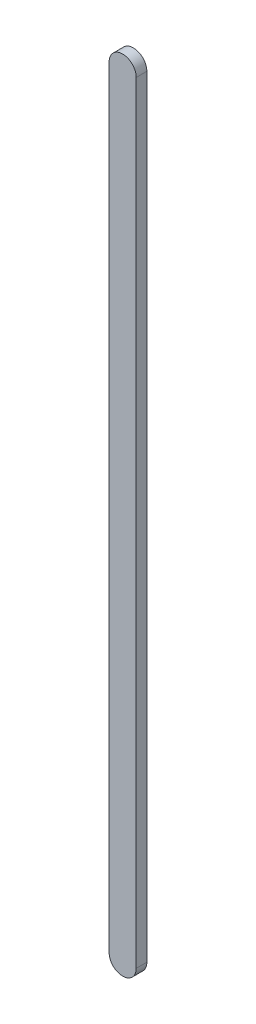
ISO-10303-21;
HEADER;
FILE_DESCRIPTION(('STEP AP214'),'2;1');
FILE_NAME('part.step','',(''),(''),'','','');
FILE_SCHEMA(('AUTOMOTIVE_DESIGN { 1 0 10303 214 1 1 1 1 }'));
ENDSEC;
DATA;
#1=APPLICATION_CONTEXT('core data for automotive mechanical design processes');
#2=APPLICATION_PROTOCOL_DEFINITION('international standard','automotive_design',2000,#1);
#3=PRODUCT_CONTEXT('',#1,'mechanical');
#4=PRODUCT('Part','Part','',(#3));
#5=PRODUCT_RELATED_PRODUCT_CATEGORY('part','',(#4));
#6=PRODUCT_DEFINITION_FORMATION('','',#4);
#7=PRODUCT_DEFINITION_CONTEXT('part definition',#1,'design');
#8=PRODUCT_DEFINITION('design','',#6,#7);
#9=PRODUCT_DEFINITION_SHAPE('','',#8);
#10=(LENGTH_UNIT() NAMED_UNIT(*) SI_UNIT(.MILLI.,.METRE.));
#11=(NAMED_UNIT(*) PLANE_ANGLE_UNIT() SI_UNIT($,.RADIAN.));
#12=(NAMED_UNIT(*) SI_UNIT($,.STERADIAN.) SOLID_ANGLE_UNIT());
#13=UNCERTAINTY_MEASURE_WITH_UNIT(LENGTH_MEASURE(1.E-05),#10,'distance_accuracy_value','');
#14=(GEOMETRIC_REPRESENTATION_CONTEXT(3) GLOBAL_UNCERTAINTY_ASSIGNED_CONTEXT((#13)) GLOBAL_UNIT_ASSIGNED_CONTEXT((#10,
#11,#12)) REPRESENTATION_CONTEXT('',''));
#15=CARTESIAN_POINT('',(0.,0.,0.));
#16=DIRECTION('',(0.,0.,1.));
#17=DIRECTION('',(1.,0.,0.));
#18=AXIS2_PLACEMENT_3D('',#15,#16,#17);
#19=CARTESIAN_POINT('',(107.569,87.6270028,0.));
#20=DIRECTION('',(-1.,0.,0.));
#21=DIRECTION('',(0.,1.,0.));
#22=AXIS2_PLACEMENT_3D('',#19,#20,#21);
#23=PLANE('',#22);
#24=DIRECTION('',(0.,1.,0.));
#25=VECTOR('',#24,1.);
#26=CARTESIAN_POINT('',(107.569,87.6270028,0.1999996));
#27=LINE('',#26,#25);
#28=CARTESIAN_POINT('',(107.569,87.6270028,0.1999996));
#29=VERTEX_POINT('',#28);
#30=CARTESIAN_POINT('',(107.569,102.108,0.1999996));
#31=VERTEX_POINT('',#30);
#32=EDGE_CURVE('E11',#29,#31,#27,.T.);
#33=ORIENTED_EDGE('',*,*,#32,.F.);
#34=DIRECTION('',(0.,0.,1.));
#35=VECTOR('',#34,1.);
#36=CARTESIAN_POINT('',(107.569,87.6270028,0.));
#37=LINE('',#36,#35);
#38=CARTESIAN_POINT('',(107.569,87.6270028,0.));
#39=VERTEX_POINT('',#38);
#40=EDGE_CURVE('E24',#39,#29,#37,.T.);
#41=ORIENTED_EDGE('',*,*,#40,.F.);
#42=DIRECTION('',(0.,1.,0.));
#43=VECTOR('',#42,1.);
#44=CARTESIAN_POINT('',(107.569,87.6270028,0.));
#45=LINE('',#44,#43);
#46=CARTESIAN_POINT('',(107.569,102.108,0.));
#47=VERTEX_POINT('',#46);
#48=EDGE_CURVE('E75',#39,#47,#45,.T.);
#49=ORIENTED_EDGE('',*,*,#48,.T.);
#50=DIRECTION('',(0.,0.,1.));
#51=VECTOR('',#50,1.);
#52=CARTESIAN_POINT('',(107.569,102.108,0.));
#53=LINE('',#52,#51);
#54=EDGE_CURVE('E37',#47,#31,#53,.T.);
#55=ORIENTED_EDGE('',*,*,#54,.T.);
#56=EDGE_LOOP('',(#33,#41,#49,#55));
#57=FACE_BOUND('',#56,.T.);
#58=ADVANCED_FACE('F17',(#57),#23,.F.);
#59=CARTESIAN_POINT('',(107.315,102.108,0.));
#60=DIRECTION('',(0.,0.,-1.));
#61=DIRECTION('',(1.,0.,0.));
#62=AXIS2_PLACEMENT_3D('',#59,#60,#61);
#63=CYLINDRICAL_SURFACE('',#62,0.254);
#64=CARTESIAN_POINT('',(107.315,102.108,0.1999996));
#65=DIRECTION('',(0.,0.,1.));
#66=DIRECTION('',(1.,0.,0.));
#67=AXIS2_PLACEMENT_3D('',#64,#65,#66);
#68=CIRCLE('',#67,0.254);
#69=CARTESIAN_POINT('',(107.061,102.108,0.1999996));
#70=VERTEX_POINT('',#69);
#71=EDGE_CURVE('E83',#31,#70,#68,.T.);
#72=ORIENTED_EDGE('',*,*,#71,.F.);
#73=ORIENTED_EDGE('',*,*,#54,.F.);
#74=CARTESIAN_POINT('',(107.315,102.108,0.));
#75=DIRECTION('',(0.,0.,1.));
#76=DIRECTION('',(1.,0.,0.));
#77=AXIS2_PLACEMENT_3D('',#74,#75,#76);
#78=CIRCLE('',#77,0.254);
#79=CARTESIAN_POINT('',(107.061,102.108,0.));
#80=VERTEX_POINT('',#79);
#81=EDGE_CURVE('E81',#47,#80,#78,.T.);
#82=ORIENTED_EDGE('',*,*,#81,.T.);
#83=DIRECTION('',(0.,0.,1.));
#84=VECTOR('',#83,1.);
#85=CARTESIAN_POINT('',(107.061,102.108,0.));
#86=LINE('',#85,#84);
#87=EDGE_CURVE('E67',#80,#70,#86,.T.);
#88=ORIENTED_EDGE('',*,*,#87,.T.);
#89=EDGE_LOOP('',(#72,#73,#82,#88));
#90=FACE_BOUND('',#89,.T.);
#91=ADVANCED_FACE('F89',(#90),#63,.T.);
#92=CARTESIAN_POINT('',(107.061,102.108,0.));
#93=DIRECTION('',(1.,0.,0.));
#94=DIRECTION('',(0.,-1.,0.));
#95=AXIS2_PLACEMENT_3D('',#92,#93,#94);
#96=PLANE('',#95);
#97=DIRECTION('',(0.,-1.,0.));
#98=VECTOR('',#97,1.);
#99=CARTESIAN_POINT('',(107.061,102.108,0.1999996));
#100=LINE('',#99,#98);
#101=CARTESIAN_POINT('',(107.061,87.6270028,0.1999996));
#102=VERTEX_POINT('',#101);
#103=EDGE_CURVE('E71',#70,#102,#100,.T.);
#104=ORIENTED_EDGE('',*,*,#103,.F.);
#105=ORIENTED_EDGE('',*,*,#87,.F.);
#106=DIRECTION('',(0.,-1.,0.));
#107=VECTOR('',#106,1.);
#108=CARTESIAN_POINT('',(107.061,102.108,0.));
#109=LINE('',#108,#107);
#110=CARTESIAN_POINT('',(107.061,87.6270028,0.));
#111=VERTEX_POINT('',#110);
#112=EDGE_CURVE('E63',#80,#111,#109,.T.);
#113=ORIENTED_EDGE('',*,*,#112,.T.);
#114=DIRECTION('',(0.,0.,1.));
#115=VECTOR('',#114,1.);
#116=CARTESIAN_POINT('',(107.061,87.6270028,0.));
#117=LINE('',#116,#115);
#118=EDGE_CURVE('E53',#111,#102,#117,.T.);
#119=ORIENTED_EDGE('',*,*,#118,.T.);
#120=EDGE_LOOP('',(#104,#105,#113,#119));
#121=FACE_BOUND('',#120,.T.);
#122=ADVANCED_FACE('F66',(#121),#96,.F.);
#123=CARTESIAN_POINT('',(107.315,87.6270028,0.));
#124=DIRECTION('',(0.,0.,-1.));
#125=DIRECTION('',(-1.,0.,0.));
#126=AXIS2_PLACEMENT_3D('',#123,#124,#125);
#127=CYLINDRICAL_SURFACE('',#126,0.254);
#128=CARTESIAN_POINT('',(107.315,87.6270028,0.1999996));
#129=DIRECTION('',(0.,0.,1.));
#130=DIRECTION('',(-1.,0.,0.));
#131=AXIS2_PLACEMENT_3D('',#128,#129,#130);
#132=CIRCLE('',#131,0.254);
#133=EDGE_CURVE('E59',#102,#29,#132,.T.);
#134=ORIENTED_EDGE('',*,*,#133,.F.);
#135=ORIENTED_EDGE('',*,*,#118,.F.);
#136=CARTESIAN_POINT('',(107.315,87.6270028,0.));
#137=DIRECTION('',(0.,0.,1.));
#138=DIRECTION('',(-1.,0.,0.));
#139=AXIS2_PLACEMENT_3D('',#136,#137,#138);
#140=CIRCLE('',#139,0.254);
#141=EDGE_CURVE('E57',#111,#39,#140,.T.);
#142=ORIENTED_EDGE('',*,*,#141,.T.);
#143=ORIENTED_EDGE('',*,*,#40,.T.);
#144=EDGE_LOOP('',(#134,#135,#142,#143));
#145=FACE_BOUND('',#144,.T.);
#146=ADVANCED_FACE('F55',(#145),#127,.T.);
#147=CARTESIAN_POINT('',(107.569,87.6270028,0.));
#148=DIRECTION('',(0.,0.,-1.));
#149=DIRECTION('',(-1.,0.,0.));
#150=AXIS2_PLACEMENT_3D('',#147,#148,#149);
#151=PLANE('',#150);
#152=ORIENTED_EDGE('',*,*,#141,.F.);
#153=ORIENTED_EDGE('',*,*,#112,.F.);
#154=ORIENTED_EDGE('',*,*,#81,.F.);
#155=ORIENTED_EDGE('',*,*,#48,.F.);
#156=EDGE_LOOP('',(#152,#153,#154,#155));
#157=FACE_BOUND('',#156,.T.);
#158=ADVANCED_FACE('F74',(#157),#151,.T.);
#159=CARTESIAN_POINT('',(107.569,87.6270028,0.1999996));
#160=DIRECTION('',(0.,0.,-1.));
#161=DIRECTION('',(-1.,0.,0.));
#162=AXIS2_PLACEMENT_3D('',#159,#160,#161);
#163=PLANE('',#162);
#164=ORIENTED_EDGE('',*,*,#32,.T.);
#165=ORIENTED_EDGE('',*,*,#71,.T.);
#166=ORIENTED_EDGE('',*,*,#103,.T.);
#167=ORIENTED_EDGE('',*,*,#133,.T.);
#168=EDGE_LOOP('',(#164,#165,#166,#167));
#169=FACE_BOUND('',#168,.T.);
#170=ADVANCED_FACE('F91',(#169),#163,.F.);
#171=CLOSED_SHELL('',(#58,#91,#122,#146,#158,#170));
#172=MANIFOLD_SOLID_BREP('B1',#171);
#173=ADVANCED_BREP_SHAPE_REPRESENTATION('',(#18,#172),#14);
#174=SHAPE_DEFINITION_REPRESENTATION(#9,#173);
ENDSEC;
END-ISO-10303-21;
